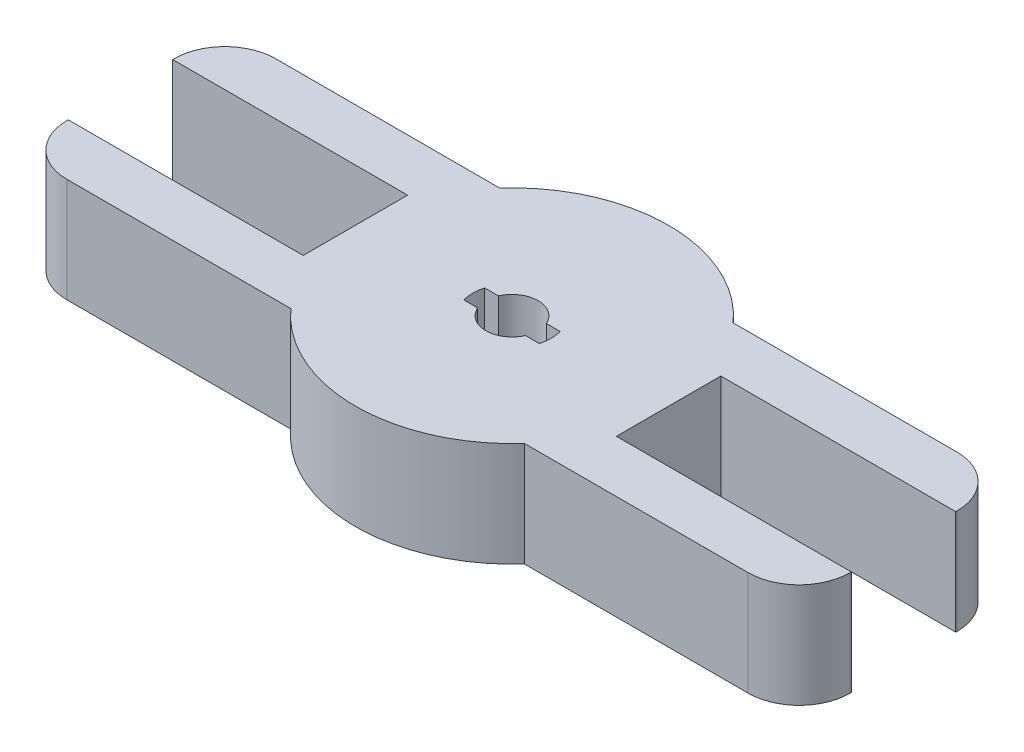
ISO-10303-21;
HEADER;
FILE_DESCRIPTION(('STEP AP214'),'2;1');
FILE_NAME('part.step','',(''),(''),'','','');
FILE_SCHEMA(('AUTOMOTIVE_DESIGN { 1 0 10303 214 1 1 1 1 }'));
ENDSEC;
DATA;
#1=APPLICATION_CONTEXT('core data for automotive mechanical design processes');
#2=APPLICATION_PROTOCOL_DEFINITION('international standard','automotive_design',2000,#1);
#3=PRODUCT_CONTEXT('',#1,'mechanical');
#4=PRODUCT('Part','Part','',(#3));
#5=PRODUCT_RELATED_PRODUCT_CATEGORY('part','',(#4));
#6=PRODUCT_DEFINITION_FORMATION('','',#4);
#7=PRODUCT_DEFINITION_CONTEXT('part definition',#1,'design');
#8=PRODUCT_DEFINITION('design','',#6,#7);
#9=PRODUCT_DEFINITION_SHAPE('','',#8);
#10=(LENGTH_UNIT() NAMED_UNIT(*) SI_UNIT(.MILLI.,.METRE.));
#11=(NAMED_UNIT(*) PLANE_ANGLE_UNIT() SI_UNIT($,.RADIAN.));
#12=(NAMED_UNIT(*) SI_UNIT($,.STERADIAN.) SOLID_ANGLE_UNIT());
#13=UNCERTAINTY_MEASURE_WITH_UNIT(LENGTH_MEASURE(1.E-05),#10,'distance_accuracy_value','');
#14=(GEOMETRIC_REPRESENTATION_CONTEXT(3) GLOBAL_UNCERTAINTY_ASSIGNED_CONTEXT((#13)) GLOBAL_UNIT_ASSIGNED_CONTEXT((#10,
#11,#12)) REPRESENTATION_CONTEXT('',''));
#15=CARTESIAN_POINT('',(0.,0.,0.));
#16=DIRECTION('',(0.,0.,1.));
#17=DIRECTION('',(1.,0.,0.));
#18=AXIS2_PLACEMENT_3D('',#15,#16,#17);
#19=CARTESIAN_POINT('',(0.,20.,0.));
#20=DIRECTION('',(0.,1.,0.));
#21=DIRECTION('',(0.,0.,1.));
#22=AXIS2_PLACEMENT_3D('',#19,#20,#21);
#23=PLANE('',#22);
#24=DIRECTION('',(0.,0.,-1.));
#25=VECTOR('',#24,1.);
#26=CARTESIAN_POINT('',(-75.,20.,-20.));
#27=LINE('',#26,#25);
#28=CARTESIAN_POINT('',(-75.,20.,10.25));
#29=VERTEX_POINT('',#28);
#30=CARTESIAN_POINT('',(-75.,20.,10.));
#31=VERTEX_POINT('',#30);
#32=EDGE_CURVE('E326',#29,#31,#27,.T.);
#33=ORIENTED_EDGE('',*,*,#32,.F.);
#34=CARTESIAN_POINT('',(-65.25,20.,10.25));
#35=DIRECTION('',(0.,1.,0.));
#36=DIRECTION('',(0.,0.,1.));
#37=AXIS2_PLACEMENT_3D('',#34,#35,#36);
#38=CIRCLE('',#37,9.75);
#39=CARTESIAN_POINT('',(-65.25,20.,20.));
#40=VERTEX_POINT('',#39);
#41=EDGE_CURVE('E511',#29,#40,#38,.T.);
#42=ORIENTED_EDGE('',*,*,#41,.T.);
#43=DIRECTION('',(-1.,0.,0.));
#44=VECTOR('',#43,1.);
#45=CARTESIAN_POINT('',(-75.,20.,20.));
#46=LINE('',#45,#44);
#47=CARTESIAN_POINT('',(-22.3606797749979,20.,20.));
#48=VERTEX_POINT('',#47);
#49=EDGE_CURVE('E329',#48,#40,#46,.T.);
#50=ORIENTED_EDGE('',*,*,#49,.F.);
#51=CARTESIAN_POINT('',(0.,20.,0.));
#52=DIRECTION('',(0.,1.,0.));
#53=DIRECTION('',(0.,0.,1.));
#54=AXIS2_PLACEMENT_3D('',#51,#52,#53);
#55=CIRCLE('',#54,30.);
#56=CARTESIAN_POINT('',(22.3606797749979,20.,20.));
#57=VERTEX_POINT('',#56);
#58=EDGE_CURVE('E431',#48,#57,#55,.T.);
#59=ORIENTED_EDGE('',*,*,#58,.T.);
#60=DIRECTION('',(1.,0.,0.));
#61=VECTOR('',#60,1.);
#62=CARTESIAN_POINT('',(75.,20.,20.));
#63=LINE('',#62,#61);
#64=CARTESIAN_POINT('',(65.25,20.,20.));
#65=VERTEX_POINT('',#64);
#66=EDGE_CURVE('E435',#57,#65,#63,.T.);
#67=ORIENTED_EDGE('',*,*,#66,.T.);
#68=CARTESIAN_POINT('',(65.25,20.,10.25));
#69=DIRECTION('',(0.,1.,0.));
#70=DIRECTION('',(0.,0.,1.));
#71=AXIS2_PLACEMENT_3D('',#68,#69,#70);
#72=CIRCLE('',#71,9.75);
#73=CARTESIAN_POINT('',(75.,20.,10.25));
#74=VERTEX_POINT('',#73);
#75=EDGE_CURVE('E486',#65,#74,#72,.T.);
#76=ORIENTED_EDGE('',*,*,#75,.T.);
#77=DIRECTION('',(0.,0.,-1.));
#78=VECTOR('',#77,1.);
#79=CARTESIAN_POINT('',(75.,20.,-20.));
#80=LINE('',#79,#78);
#81=CARTESIAN_POINT('',(75.,20.,10.));
#82=VERTEX_POINT('',#81);
#83=EDGE_CURVE('E440',#74,#82,#80,.T.);
#84=ORIENTED_EDGE('',*,*,#83,.T.);
#85=DIRECTION('',(1.,0.,0.));
#86=VECTOR('',#85,1.);
#87=CARTESIAN_POINT('',(30.,20.,10.));
#88=LINE('',#87,#86);
#89=CARTESIAN_POINT('',(30.,20.,10.));
#90=VERTEX_POINT('',#89);
#91=EDGE_CURVE('E400',#90,#82,#88,.T.);
#92=ORIENTED_EDGE('',*,*,#91,.F.);
#93=DIRECTION('',(0.,0.,1.));
#94=VECTOR('',#93,1.);
#95=CARTESIAN_POINT('',(30.,20.,-10.));
#96=LINE('',#95,#94);
#97=CARTESIAN_POINT('',(30.,20.,-10.));
#98=VERTEX_POINT('',#97);
#99=EDGE_CURVE('E415',#98,#90,#96,.T.);
#100=ORIENTED_EDGE('',*,*,#99,.F.);
#101=DIRECTION('',(-1.,0.,0.));
#102=VECTOR('',#101,1.);
#103=CARTESIAN_POINT('',(75.,20.,-10.));
#104=LINE('',#103,#102);
#105=CARTESIAN_POINT('',(75.,20.,-10.));
#106=VERTEX_POINT('',#105);
#107=EDGE_CURVE('E243',#106,#98,#104,.T.);
#108=ORIENTED_EDGE('',*,*,#107,.F.);
#109=CARTESIAN_POINT('',(75.,20.,-10.25));
#110=VERTEX_POINT('',#109);
#111=EDGE_CURVE('E439',#106,#110,#80,.T.);
#112=ORIENTED_EDGE('',*,*,#111,.T.);
#113=CARTESIAN_POINT('',(65.25,20.,-10.25));
#114=DIRECTION('',(0.,1.,0.));
#115=DIRECTION('',(0.,0.,1.));
#116=AXIS2_PLACEMENT_3D('',#113,#114,#115);
#117=CIRCLE('',#116,9.75);
#118=CARTESIAN_POINT('',(65.25,20.,-20.));
#119=VERTEX_POINT('',#118);
#120=EDGE_CURVE('E483',#110,#119,#117,.T.);
#121=ORIENTED_EDGE('',*,*,#120,.T.);
#122=DIRECTION('',(-1.,0.,0.));
#123=VECTOR('',#122,1.);
#124=CARTESIAN_POINT('',(22.3606797749979,20.,-20.));
#125=LINE('',#124,#123);
#126=CARTESIAN_POINT('',(22.3606797749979,20.,-20.));
#127=VERTEX_POINT('',#126);
#128=EDGE_CURVE('E443',#119,#127,#125,.T.);
#129=ORIENTED_EDGE('',*,*,#128,.T.);
#130=CARTESIAN_POINT('',(0.,20.,0.));
#131=DIRECTION('',(0.,1.,0.));
#132=DIRECTION('',(0.,0.,1.));
#133=AXIS2_PLACEMENT_3D('',#130,#131,#132);
#134=CIRCLE('',#133,30.);
#135=CARTESIAN_POINT('',(-22.3606797749979,20.,-20.));
#136=VERTEX_POINT('',#135);
#137=EDGE_CURVE('E427',#127,#136,#134,.T.);
#138=ORIENTED_EDGE('',*,*,#137,.T.);
#139=DIRECTION('',(1.,0.,0.));
#140=VECTOR('',#139,1.);
#141=CARTESIAN_POINT('',(-22.3606797749979,20.,-20.));
#142=LINE('',#141,#140);
#143=CARTESIAN_POINT('',(-65.25,20.,-20.));
#144=VERTEX_POINT('',#143);
#145=EDGE_CURVE('E321',#144,#136,#142,.T.);
#146=ORIENTED_EDGE('',*,*,#145,.F.);
#147=CARTESIAN_POINT('',(-65.25,20.,-10.25));
#148=DIRECTION('',(0.,1.,0.));
#149=DIRECTION('',(0.,0.,1.));
#150=AXIS2_PLACEMENT_3D('',#147,#148,#149);
#151=CIRCLE('',#150,9.75);
#152=CARTESIAN_POINT('',(-75.,20.,-10.25));
#153=VERTEX_POINT('',#152);
#154=EDGE_CURVE('E61',#144,#153,#151,.T.);
#155=ORIENTED_EDGE('',*,*,#154,.T.);
#156=CARTESIAN_POINT('',(-75.,20.,-10.));
#157=VERTEX_POINT('',#156);
#158=EDGE_CURVE('E324',#157,#153,#27,.T.);
#159=ORIENTED_EDGE('',*,*,#158,.F.);
#160=DIRECTION('',(1.,0.,0.));
#161=VECTOR('',#160,1.);
#162=CARTESIAN_POINT('',(-75.,20.,-10.));
#163=LINE('',#162,#161);
#164=CARTESIAN_POINT('',(-30.,20.,-10.));
#165=VERTEX_POINT('',#164);
#166=EDGE_CURVE('E296',#157,#165,#163,.T.);
#167=ORIENTED_EDGE('',*,*,#166,.T.);
#168=DIRECTION('',(0.,0.,1.));
#169=VECTOR('',#168,1.);
#170=CARTESIAN_POINT('',(-30.,20.,-10.));
#171=LINE('',#170,#169);
#172=CARTESIAN_POINT('',(-30.,20.,10.));
#173=VERTEX_POINT('',#172);
#174=EDGE_CURVE('E304',#165,#173,#171,.T.);
#175=ORIENTED_EDGE('',*,*,#174,.T.);
#176=DIRECTION('',(-1.,0.,0.));
#177=VECTOR('',#176,1.);
#178=CARTESIAN_POINT('',(-30.,20.,10.));
#179=LINE('',#178,#177);
#180=EDGE_CURVE('E300',#173,#31,#179,.T.);
#181=ORIENTED_EDGE('',*,*,#180,.T.);
#182=EDGE_LOOP('',(#33,#42,#50,#59,#67,#76,#84,#92,#100,#108,#112,#121,#129,#138,#146,#155,#159,
#167,#175,#181));
#183=FACE_BOUND('',#182,.T.);
#184=CARTESIAN_POINT('',(0.,20.,0.));
#185=DIRECTION('',(0.,1.,0.));
#186=DIRECTION('',(0.,0.,1.));
#187=AXIS2_PLACEMENT_3D('',#184,#185,#186);
#188=CIRCLE('',#187,5.);
#189=CARTESIAN_POINT('',(-4.58257569495584,20.,2.));
#190=VERTEX_POINT('',#189);
#191=CARTESIAN_POINT('',(4.58257569495584,20.,2.));
#192=VERTEX_POINT('',#191);
#193=EDGE_CURVE('E242',#190,#192,#188,.T.);
#194=ORIENTED_EDGE('',*,*,#193,.F.);
#195=DIRECTION('',(-1.,0.,0.));
#196=VECTOR('',#195,1.);
#197=CARTESIAN_POINT('',(-7.22841614740048,20.,2.));
#198=LINE('',#197,#196);
#199=CARTESIAN_POINT('',(-7.22841614740048,20.,2.));
#200=VERTEX_POINT('',#199);
#201=EDGE_CURVE('E256',#190,#200,#198,.T.);
#202=ORIENTED_EDGE('',*,*,#201,.T.);
#203=CARTESIAN_POINT('',(0.,20.,0.));
#204=DIRECTION('',(0.,-1.,0.));
#205=DIRECTION('',(0.,0.,1.));
#206=AXIS2_PLACEMENT_3D('',#203,#204,#205);
#207=CIRCLE('',#206,7.5);
#208=CARTESIAN_POINT('',(-7.22841614740048,20.,-2.));
#209=VERTEX_POINT('',#208);
#210=EDGE_CURVE('E260',#200,#209,#207,.T.);
#211=ORIENTED_EDGE('',*,*,#210,.T.);
#212=DIRECTION('',(1.,0.,0.));
#213=VECTOR('',#212,1.);
#214=CARTESIAN_POINT('',(-7.22841614740048,20.,-2.));
#215=LINE('',#214,#213);
#216=CARTESIAN_POINT('',(-4.58257569495584,20.,-2.));
#217=VERTEX_POINT('',#216);
#218=EDGE_CURVE('E250',#209,#217,#215,.T.);
#219=ORIENTED_EDGE('',*,*,#218,.T.);
#220=CARTESIAN_POINT('',(0.,20.,0.));
#221=DIRECTION('',(0.,1.,0.));
#222=DIRECTION('',(0.,0.,1.));
#223=AXIS2_PLACEMENT_3D('',#220,#221,#222);
#224=CIRCLE('',#223,5.);
#225=CARTESIAN_POINT('',(4.58257569495584,20.,-2.));
#226=VERTEX_POINT('',#225);
#227=EDGE_CURVE('E231',#226,#217,#224,.T.);
#228=ORIENTED_EDGE('',*,*,#227,.F.);
#229=DIRECTION('',(-1.,0.,0.));
#230=VECTOR('',#229,1.);
#231=CARTESIAN_POINT('',(7.22841614740048,20.,-2.));
#232=LINE('',#231,#230);
#233=CARTESIAN_POINT('',(7.22841614740048,20.,-2.));
#234=VERTEX_POINT('',#233);
#235=EDGE_CURVE('E380',#234,#226,#232,.T.);
#236=ORIENTED_EDGE('',*,*,#235,.F.);
#237=CARTESIAN_POINT('',(0.,20.,0.));
#238=DIRECTION('',(0.,1.,0.));
#239=DIRECTION('',(0.,0.,1.));
#240=AXIS2_PLACEMENT_3D('',#237,#238,#239);
#241=CIRCLE('',#240,7.5);
#242=CARTESIAN_POINT('',(7.22841614740048,20.,2.));
#243=VERTEX_POINT('',#242);
#244=EDGE_CURVE('E376',#243,#234,#241,.T.);
#245=ORIENTED_EDGE('',*,*,#244,.F.);
#246=DIRECTION('',(1.,0.,0.));
#247=VECTOR('',#246,1.);
#248=CARTESIAN_POINT('',(7.22841614740048,20.,2.));
#249=LINE('',#248,#247);
#250=EDGE_CURVE('E372',#192,#243,#249,.T.);
#251=ORIENTED_EDGE('',*,*,#250,.F.);
#252=EDGE_LOOP('',(#194,#202,#211,#219,#228,#236,#245,#251));
#253=FACE_BOUND('',#252,.T.);
#254=ADVANCED_FACE('F45',(#183,#253),#23,.T.);
#255=CARTESIAN_POINT('',(0.,0.,0.));
#256=DIRECTION('',(0.,1.,0.));
#257=DIRECTION('',(0.,0.,1.));
#258=AXIS2_PLACEMENT_3D('',#255,#256,#257);
#259=PLANE('',#258);
#260=DIRECTION('',(-1.,0.,0.));
#261=VECTOR('',#260,1.);
#262=CARTESIAN_POINT('',(-75.,0.,20.));
#263=LINE('',#262,#261);
#264=CARTESIAN_POINT('',(-22.3606797749979,0.,20.));
#265=VERTEX_POINT('',#264);
#266=CARTESIAN_POINT('',(-65.25,0.,20.));
#267=VERTEX_POINT('',#266);
#268=EDGE_CURVE('E325',#265,#267,#263,.T.);
#269=ORIENTED_EDGE('',*,*,#268,.T.);
#270=CARTESIAN_POINT('',(-65.25,0.,10.25));
#271=DIRECTION('',(0.,1.,0.));
#272=DIRECTION('',(0.,0.,1.));
#273=AXIS2_PLACEMENT_3D('',#270,#271,#272);
#274=CIRCLE('',#273,9.75);
#275=CARTESIAN_POINT('',(-75.,0.,10.25));
#276=VERTEX_POINT('',#275);
#277=EDGE_CURVE('E503',#267,#276,#274,.F.);
#278=ORIENTED_EDGE('',*,*,#277,.T.);
#279=DIRECTION('',(0.,0.,-1.));
#280=VECTOR('',#279,1.);
#281=CARTESIAN_POINT('',(-75.,0.,-20.));
#282=LINE('',#281,#280);
#283=CARTESIAN_POINT('',(-75.,0.,10.));
#284=VERTEX_POINT('',#283);
#285=EDGE_CURVE('E338',#276,#284,#282,.T.);
#286=ORIENTED_EDGE('',*,*,#285,.T.);
#287=DIRECTION('',(1.,0.,0.));
#288=VECTOR('',#287,1.);
#289=CARTESIAN_POINT('',(-30.,0.,10.));
#290=LINE('',#289,#288);
#291=CARTESIAN_POINT('',(-30.,0.,10.));
#292=VERTEX_POINT('',#291);
#293=EDGE_CURVE('E288',#284,#292,#290,.T.);
#294=ORIENTED_EDGE('',*,*,#293,.T.);
#295=DIRECTION('',(0.,0.,-1.));
#296=VECTOR('',#295,1.);
#297=CARTESIAN_POINT('',(-30.,0.,-10.));
#298=LINE('',#297,#296);
#299=CARTESIAN_POINT('',(-30.,0.,-10.));
#300=VERTEX_POINT('',#299);
#301=EDGE_CURVE('E268',#292,#300,#298,.T.);
#302=ORIENTED_EDGE('',*,*,#301,.T.);
#303=DIRECTION('',(-1.,0.,0.));
#304=VECTOR('',#303,1.);
#305=CARTESIAN_POINT('',(-75.,0.,-10.));
#306=LINE('',#305,#304);
#307=CARTESIAN_POINT('',(-75.,0.,-10.));
#308=VERTEX_POINT('',#307);
#309=EDGE_CURVE('E262',#300,#308,#306,.T.);
#310=ORIENTED_EDGE('',*,*,#309,.T.);
#311=CARTESIAN_POINT('',(-75.,0.,-10.25));
#312=VERTEX_POINT('',#311);
#313=EDGE_CURVE('E337',#308,#312,#282,.T.);
#314=ORIENTED_EDGE('',*,*,#313,.T.);
#315=CARTESIAN_POINT('',(-65.25,0.,-10.25));
#316=DIRECTION('',(0.,1.,0.));
#317=DIRECTION('',(0.,0.,1.));
#318=AXIS2_PLACEMENT_3D('',#315,#316,#317);
#319=CIRCLE('',#318,9.75);
#320=CARTESIAN_POINT('',(-65.25,0.,-20.));
#321=VERTEX_POINT('',#320);
#322=EDGE_CURVE('E500',#312,#321,#319,.F.);
#323=ORIENTED_EDGE('',*,*,#322,.T.);
#324=DIRECTION('',(1.,0.,0.));
#325=VECTOR('',#324,1.);
#326=CARTESIAN_POINT('',(-22.3606797749979,0.,-20.));
#327=LINE('',#326,#325);
#328=CARTESIAN_POINT('',(-22.3606797749979,0.,-20.));
#329=VERTEX_POINT('',#328);
#330=EDGE_CURVE('E334',#321,#329,#327,.T.);
#331=ORIENTED_EDGE('',*,*,#330,.T.);
#332=CARTESIAN_POINT('',(0.,0.,0.));
#333=DIRECTION('',(0.,1.,0.));
#334=DIRECTION('',(0.,0.,1.));
#335=AXIS2_PLACEMENT_3D('',#332,#333,#334);
#336=CIRCLE('',#335,30.);
#337=CARTESIAN_POINT('',(22.3606797749979,0.,-20.));
#338=VERTEX_POINT('',#337);
#339=EDGE_CURVE('E367',#338,#329,#336,.T.);
#340=ORIENTED_EDGE('',*,*,#339,.F.);
#341=DIRECTION('',(-1.,0.,0.));
#342=VECTOR('',#341,1.);
#343=CARTESIAN_POINT('',(22.3606797749979,0.,-20.));
#344=LINE('',#343,#342);
#345=CARTESIAN_POINT('',(65.25,0.,-20.));
#346=VERTEX_POINT('',#345);
#347=EDGE_CURVE('E432',#346,#338,#344,.T.);
#348=ORIENTED_EDGE('',*,*,#347,.F.);
#349=CARTESIAN_POINT('',(65.25,0.,-10.25));
#350=DIRECTION('',(0.,1.,0.));
#351=DIRECTION('',(0.,0.,1.));
#352=AXIS2_PLACEMENT_3D('',#349,#350,#351);
#353=CIRCLE('',#352,9.75);
#354=CARTESIAN_POINT('',(75.,0.,-10.25));
#355=VERTEX_POINT('',#354);
#356=EDGE_CURVE('E474',#346,#355,#353,.F.);
#357=ORIENTED_EDGE('',*,*,#356,.T.);
#358=DIRECTION('',(0.,0.,-1.));
#359=VECTOR('',#358,1.);
#360=CARTESIAN_POINT('',(75.,0.,-20.));
#361=LINE('',#360,#359);
#362=CARTESIAN_POINT('',(75.,0.,-10.));
#363=VERTEX_POINT('',#362);
#364=EDGE_CURVE('E457',#363,#355,#361,.T.);
#365=ORIENTED_EDGE('',*,*,#364,.F.);
#366=DIRECTION('',(1.,0.,0.));
#367=VECTOR('',#366,1.);
#368=CARTESIAN_POINT('',(75.,0.,-10.));
#369=LINE('',#368,#367);
#370=CARTESIAN_POINT('',(30.,0.,-10.));
#371=VERTEX_POINT('',#370);
#372=EDGE_CURVE('E396',#371,#363,#369,.T.);
#373=ORIENTED_EDGE('',*,*,#372,.F.);
#374=DIRECTION('',(0.,0.,-1.));
#375=VECTOR('',#374,1.);
#376=CARTESIAN_POINT('',(30.,0.,-10.));
#377=LINE('',#376,#375);
#378=CARTESIAN_POINT('',(30.,0.,10.));
#379=VERTEX_POINT('',#378);
#380=EDGE_CURVE('E351',#379,#371,#377,.T.);
#381=ORIENTED_EDGE('',*,*,#380,.F.);
#382=DIRECTION('',(-1.,0.,0.));
#383=VECTOR('',#382,1.);
#384=CARTESIAN_POINT('',(30.,0.,10.));
#385=LINE('',#384,#383);
#386=CARTESIAN_POINT('',(75.,0.,10.));
#387=VERTEX_POINT('',#386);
#388=EDGE_CURVE('E411',#387,#379,#385,.T.);
#389=ORIENTED_EDGE('',*,*,#388,.F.);
#390=CARTESIAN_POINT('',(75.,0.,10.25));
#391=VERTEX_POINT('',#390);
#392=EDGE_CURVE('E458',#391,#387,#361,.T.);
#393=ORIENTED_EDGE('',*,*,#392,.F.);
#394=CARTESIAN_POINT('',(65.25,0.,10.25));
#395=DIRECTION('',(0.,1.,0.));
#396=DIRECTION('',(0.,0.,1.));
#397=AXIS2_PLACEMENT_3D('',#394,#395,#396);
#398=CIRCLE('',#397,9.75);
#399=CARTESIAN_POINT('',(65.25,0.,20.));
#400=VERTEX_POINT('',#399);
#401=EDGE_CURVE('E477',#391,#400,#398,.F.);
#402=ORIENTED_EDGE('',*,*,#401,.T.);
#403=DIRECTION('',(1.,0.,0.));
#404=VECTOR('',#403,1.);
#405=CARTESIAN_POINT('',(75.,0.,20.));
#406=LINE('',#405,#404);
#407=CARTESIAN_POINT('',(22.3606797749979,0.,20.));
#408=VERTEX_POINT('',#407);
#409=EDGE_CURVE('E453',#408,#400,#406,.T.);
#410=ORIENTED_EDGE('',*,*,#409,.F.);
#411=CARTESIAN_POINT('',(0.,0.,0.));
#412=DIRECTION('',(0.,1.,0.));
#413=DIRECTION('',(0.,0.,1.));
#414=AXIS2_PLACEMENT_3D('',#411,#412,#413);
#415=CIRCLE('',#414,30.);
#416=EDGE_CURVE('E450',#265,#408,#415,.T.);
#417=ORIENTED_EDGE('',*,*,#416,.F.);
#418=EDGE_LOOP('',(#269,#278,#286,#294,#302,#310,#314,#323,#331,#340,#348,#357,#365,#373,#381,
#389,#393,#402,#410,#417));
#419=FACE_BOUND('',#418,.T.);
#420=DIRECTION('',(1.,0.,0.));
#421=VECTOR('',#420,1.);
#422=CARTESIAN_POINT('',(-7.22841614740048,0.,2.));
#423=LINE('',#422,#421);
#424=CARTESIAN_POINT('',(-7.22841614740048,0.,2.));
#425=VERTEX_POINT('',#424);
#426=CARTESIAN_POINT('',(-4.58257569495584,0.,2.));
#427=VERTEX_POINT('',#426);
#428=EDGE_CURVE('E271',#425,#427,#423,.T.);
#429=ORIENTED_EDGE('',*,*,#428,.T.);
#430=CARTESIAN_POINT('',(0.,0.,0.));
#431=DIRECTION('',(0.,1.,0.));
#432=DIRECTION('',(0.,0.,1.));
#433=AXIS2_PLACEMENT_3D('',#430,#431,#432);
#434=CIRCLE('',#433,5.);
#435=CARTESIAN_POINT('',(4.58257569495584,0.,2.));
#436=VERTEX_POINT('',#435);
#437=EDGE_CURVE('E352',#436,#427,#434,.F.);
#438=ORIENTED_EDGE('',*,*,#437,.F.);
#439=DIRECTION('',(-1.,0.,0.));
#440=VECTOR('',#439,1.);
#441=CARTESIAN_POINT('',(7.22841614740048,0.,2.));
#442=LINE('',#441,#440);
#443=CARTESIAN_POINT('',(7.22841614740048,0.,2.));
#444=VERTEX_POINT('',#443);
#445=EDGE_CURVE('E355',#444,#436,#442,.T.);
#446=ORIENTED_EDGE('',*,*,#445,.F.);
#447=CARTESIAN_POINT('',(0.,0.,0.));
#448=DIRECTION('',(0.,1.,0.));
#449=DIRECTION('',(0.,0.,1.));
#450=AXIS2_PLACEMENT_3D('',#447,#448,#449);
#451=CIRCLE('',#450,7.5);
#452=CARTESIAN_POINT('',(7.22841614740048,0.,-2.));
#453=VERTEX_POINT('',#452);
#454=EDGE_CURVE('E359',#453,#444,#451,.F.);
#455=ORIENTED_EDGE('',*,*,#454,.F.);
#456=DIRECTION('',(1.,0.,0.));
#457=VECTOR('',#456,1.);
#458=CARTESIAN_POINT('',(7.22841614740048,0.,-2.));
#459=LINE('',#458,#457);
#460=CARTESIAN_POINT('',(4.58257569495584,0.,-2.));
#461=VERTEX_POINT('',#460);
#462=EDGE_CURVE('E362',#461,#453,#459,.T.);
#463=ORIENTED_EDGE('',*,*,#462,.F.);
#464=CARTESIAN_POINT('',(0.,0.,0.));
#465=DIRECTION('',(0.,1.,0.));
#466=DIRECTION('',(0.,0.,1.));
#467=AXIS2_PLACEMENT_3D('',#464,#465,#466);
#468=CIRCLE('',#467,5.);
#469=CARTESIAN_POINT('',(-4.58257569495584,0.,-2.));
#470=VERTEX_POINT('',#469);
#471=EDGE_CURVE('E365',#470,#461,#468,.F.);
#472=ORIENTED_EDGE('',*,*,#471,.F.);
#473=DIRECTION('',(-1.,0.,0.));
#474=VECTOR('',#473,1.);
#475=CARTESIAN_POINT('',(-7.22841614740048,0.,-2.));
#476=LINE('',#475,#474);
#477=CARTESIAN_POINT('',(-7.22841614740048,0.,-2.));
#478=VERTEX_POINT('',#477);
#479=EDGE_CURVE('E253',#470,#478,#476,.T.);
#480=ORIENTED_EDGE('',*,*,#479,.T.);
#481=CARTESIAN_POINT('',(0.,0.,0.));
#482=DIRECTION('',(0.,1.,0.));
#483=DIRECTION('',(0.,0.,1.));
#484=AXIS2_PLACEMENT_3D('',#481,#482,#483);
#485=CIRCLE('',#484,7.5);
#486=EDGE_CURVE('E287',#478,#425,#485,.T.);
#487=ORIENTED_EDGE('',*,*,#486,.T.);
#488=EDGE_LOOP('',(#429,#438,#446,#455,#463,#472,#480,#487));
#489=FACE_BOUND('',#488,.T.);
#490=ADVANCED_FACE('F522',(#419,#489),#259,.F.);
#491=CARTESIAN_POINT('',(-75.,20.,-20.));
#492=DIRECTION('',(-1.,0.,0.));
#493=DIRECTION('',(0.,0.,1.));
#494=AXIS2_PLACEMENT_3D('',#491,#492,#493);
#495=PLANE('',#494);
#496=ORIENTED_EDGE('',*,*,#285,.F.);
#497=DIRECTION('',(0.,-1.,0.));
#498=VECTOR('',#497,1.);
#499=CARTESIAN_POINT('',(-75.,20.,10.25));
#500=LINE('',#499,#498);
#501=EDGE_CURVE('E506',#276,#29,#500,.F.);
#502=ORIENTED_EDGE('',*,*,#501,.T.);
#503=ORIENTED_EDGE('',*,*,#32,.T.);
#504=DIRECTION('',(0.,1.,0.));
#505=VECTOR('',#504,1.);
#506=CARTESIAN_POINT('',(-75.,-49.2442890089805,10.));
#507=LINE('',#506,#505);
#508=EDGE_CURVE('E314',#284,#31,#507,.T.);
#509=ORIENTED_EDGE('',*,*,#508,.F.);
#510=EDGE_LOOP('',(#496,#502,#503,#509));
#511=FACE_BOUND('',#510,.T.);
#512=ADVANCED_FACE('F569',(#511),#495,.T.);
#513=ORIENTED_EDGE('',*,*,#158,.T.);
#514=DIRECTION('',(0.,-1.,0.));
#515=VECTOR('',#514,1.);
#516=CARTESIAN_POINT('',(-75.,20.,-10.25));
#517=LINE('',#516,#515);
#518=EDGE_CURVE('E54',#153,#312,#517,.T.);
#519=ORIENTED_EDGE('',*,*,#518,.T.);
#520=ORIENTED_EDGE('',*,*,#313,.F.);
#521=DIRECTION('',(0.,1.,0.));
#522=VECTOR('',#521,1.);
#523=CARTESIAN_POINT('',(-75.,-49.2442890089805,-10.));
#524=LINE('',#523,#522);
#525=EDGE_CURVE('E308',#308,#157,#524,.T.);
#526=ORIENTED_EDGE('',*,*,#525,.T.);
#527=EDGE_LOOP('',(#513,#519,#520,#526));
#528=FACE_BOUND('',#527,.T.);
#529=ADVANCED_FACE('F519',(#528),#495,.T.);
#530=CARTESIAN_POINT('',(75.,20.,-20.));
#531=DIRECTION('',(-1.,0.,0.));
#532=DIRECTION('',(0.,0.,1.));
#533=AXIS2_PLACEMENT_3D('',#530,#531,#532);
#534=PLANE('',#533);
#535=ORIENTED_EDGE('',*,*,#364,.T.);
#536=DIRECTION('',(0.,-1.,0.));
#537=VECTOR('',#536,1.);
#538=CARTESIAN_POINT('',(75.,20.,-10.25));
#539=LINE('',#538,#537);
#540=EDGE_CURVE('E493',#355,#110,#539,.F.);
#541=ORIENTED_EDGE('',*,*,#540,.T.);
#542=ORIENTED_EDGE('',*,*,#111,.F.);
#543=DIRECTION('',(0.,1.,0.));
#544=VECTOR('',#543,1.);
#545=CARTESIAN_POINT('',(75.,-49.2442890089805,-10.));
#546=LINE('',#545,#544);
#547=EDGE_CURVE('E408',#363,#106,#546,.T.);
#548=ORIENTED_EDGE('',*,*,#547,.F.);
#549=EDGE_LOOP('',(#535,#541,#542,#548));
#550=FACE_BOUND('',#549,.T.);
#551=ADVANCED_FACE('F586',(#550),#534,.F.);
#552=CARTESIAN_POINT('',(0.,20.,0.));
#553=DIRECTION('',(0.,-1.,0.));
#554=DIRECTION('',(0.,0.,-1.));
#555=AXIS2_PLACEMENT_3D('',#552,#553,#554);
#556=CYLINDRICAL_SURFACE('',#555,30.);
#557=ORIENTED_EDGE('',*,*,#339,.T.);
#558=DIRECTION('',(0.,-1.,0.));
#559=VECTOR('',#558,1.);
#560=CARTESIAN_POINT('',(-22.3606797749979,20.,-20.));
#561=LINE('',#560,#559);
#562=EDGE_CURVE('E347',#136,#329,#561,.T.);
#563=ORIENTED_EDGE('',*,*,#562,.F.);
#564=ORIENTED_EDGE('',*,*,#137,.F.);
#565=DIRECTION('',(0.,-1.,0.));
#566=VECTOR('',#565,1.);
#567=CARTESIAN_POINT('',(22.3606797749979,20.,-20.));
#568=LINE('',#567,#566);
#569=EDGE_CURVE('E446',#127,#338,#568,.T.);
#570=ORIENTED_EDGE('',*,*,#569,.T.);
#571=EDGE_LOOP('',(#557,#563,#564,#570));
#572=FACE_BOUND('',#571,.T.);
#573=ADVANCED_FACE('F593',(#572),#556,.T.);
#574=CARTESIAN_POINT('',(0.,20.,0.));
#575=DIRECTION('',(0.,-1.,0.));
#576=DIRECTION('',(0.,0.,-1.));
#577=AXIS2_PLACEMENT_3D('',#574,#575,#576);
#578=CYLINDRICAL_SURFACE('',#577,30.);
#579=ORIENTED_EDGE('',*,*,#416,.T.);
#580=DIRECTION('',(0.,-1.,0.));
#581=VECTOR('',#580,1.);
#582=CARTESIAN_POINT('',(22.3606797749979,20.,20.));
#583=LINE('',#582,#581);
#584=EDGE_CURVE('E466',#57,#408,#583,.T.);
#585=ORIENTED_EDGE('',*,*,#584,.F.);
#586=ORIENTED_EDGE('',*,*,#58,.F.);
#587=DIRECTION('',(0.,-1.,0.));
#588=VECTOR('',#587,1.);
#589=CARTESIAN_POINT('',(-22.3606797749979,20.,20.));
#590=LINE('',#589,#588);
#591=EDGE_CURVE('E333',#48,#265,#590,.T.);
#592=ORIENTED_EDGE('',*,*,#591,.T.);
#593=EDGE_LOOP('',(#579,#585,#586,#592));
#594=FACE_BOUND('',#593,.T.);
#595=ADVANCED_FACE('F589',(#594),#578,.T.);
#596=CARTESIAN_POINT('',(75.,20.,20.));
#597=DIRECTION('',(0.,0.,-1.));
#598=DIRECTION('',(-1.,0.,0.));
#599=AXIS2_PLACEMENT_3D('',#596,#597,#598);
#600=PLANE('',#599);
#601=ORIENTED_EDGE('',*,*,#409,.T.);
#602=DIRECTION('',(0.,-1.,0.));
#603=VECTOR('',#602,1.);
#604=CARTESIAN_POINT('',(65.25,20.,20.));
#605=LINE('',#604,#603);
#606=EDGE_CURVE('E480',#400,#65,#605,.F.);
#607=ORIENTED_EDGE('',*,*,#606,.T.);
#608=ORIENTED_EDGE('',*,*,#66,.F.);
#609=ORIENTED_EDGE('',*,*,#584,.T.);
#610=EDGE_LOOP('',(#601,#607,#608,#609));
#611=FACE_BOUND('',#610,.T.);
#612=ADVANCED_FACE('F584',(#611),#600,.F.);
#613=ORIENTED_EDGE('',*,*,#83,.F.);
#614=DIRECTION('',(0.,-1.,0.));
#615=VECTOR('',#614,1.);
#616=CARTESIAN_POINT('',(75.,20.,10.25));
#617=LINE('',#616,#615);
#618=EDGE_CURVE('E470',#74,#391,#617,.T.);
#619=ORIENTED_EDGE('',*,*,#618,.T.);
#620=ORIENTED_EDGE('',*,*,#392,.T.);
#621=DIRECTION('',(0.,1.,0.));
#622=VECTOR('',#621,1.);
#623=CARTESIAN_POINT('',(75.,-49.2442890089805,10.));
#624=LINE('',#623,#622);
#625=EDGE_CURVE('E404',#387,#82,#624,.T.);
#626=ORIENTED_EDGE('',*,*,#625,.T.);
#627=EDGE_LOOP('',(#613,#619,#620,#626));
#628=FACE_BOUND('',#627,.T.);
#629=ADVANCED_FACE('F580',(#628),#534,.F.);
#630=CARTESIAN_POINT('',(22.3606797749979,20.,-20.));
#631=DIRECTION('',(0.,0.,1.));
#632=DIRECTION('',(1.,0.,0.));
#633=AXIS2_PLACEMENT_3D('',#630,#631,#632);
#634=PLANE('',#633);
#635=ORIENTED_EDGE('',*,*,#128,.F.);
#636=DIRECTION('',(0.,-1.,0.));
#637=VECTOR('',#636,1.);
#638=CARTESIAN_POINT('',(65.25,20.,-20.));
#639=LINE('',#638,#637);
#640=EDGE_CURVE('E489',#119,#346,#639,.T.);
#641=ORIENTED_EDGE('',*,*,#640,.T.);
#642=ORIENTED_EDGE('',*,*,#347,.T.);
#643=ORIENTED_EDGE('',*,*,#569,.F.);
#644=EDGE_LOOP('',(#635,#641,#642,#643));
#645=FACE_BOUND('',#644,.T.);
#646=ADVANCED_FACE('F576',(#645),#634,.F.);
#647=CARTESIAN_POINT('',(75.,-49.2442890089805,-10.));
#648=DIRECTION('',(0.,0.,-1.));
#649=DIRECTION('',(-1.,0.,0.));
#650=AXIS2_PLACEMENT_3D('',#647,#648,#649);
#651=PLANE('',#650);
#652=ORIENTED_EDGE('',*,*,#372,.T.);
#653=ORIENTED_EDGE('',*,*,#547,.T.);
#654=ORIENTED_EDGE('',*,*,#107,.T.);
#655=DIRECTION('',(0.,1.,0.));
#656=VECTOR('',#655,1.);
#657=CARTESIAN_POINT('',(30.,-49.2442890089805,-10.));
#658=LINE('',#657,#656);
#659=EDGE_CURVE('E397',#371,#98,#658,.T.);
#660=ORIENTED_EDGE('',*,*,#659,.F.);
#661=EDGE_LOOP('',(#652,#653,#654,#660));
#662=FACE_BOUND('',#661,.T.);
#663=ADVANCED_FACE('F579',(#662),#651,.F.);
#664=CARTESIAN_POINT('',(30.,-49.2442890089805,10.));
#665=DIRECTION('',(0.,0.,1.));
#666=DIRECTION('',(1.,0.,0.));
#667=AXIS2_PLACEMENT_3D('',#664,#665,#666);
#668=PLANE('',#667);
#669=ORIENTED_EDGE('',*,*,#388,.T.);
#670=DIRECTION('',(0.,1.,0.));
#671=VECTOR('',#670,1.);
#672=CARTESIAN_POINT('',(30.,-49.2442890089805,10.));
#673=LINE('',#672,#671);
#674=EDGE_CURVE('E401',#379,#90,#673,.T.);
#675=ORIENTED_EDGE('',*,*,#674,.T.);
#676=ORIENTED_EDGE('',*,*,#91,.T.);
#677=ORIENTED_EDGE('',*,*,#625,.F.);
#678=EDGE_LOOP('',(#669,#675,#676,#677));
#679=FACE_BOUND('',#678,.T.);
#680=ADVANCED_FACE('F573',(#679),#668,.F.);
#681=CARTESIAN_POINT('',(30.,-49.2442890089805,-10.));
#682=DIRECTION('',(-1.,0.,0.));
#683=DIRECTION('',(0.,0.,1.));
#684=AXIS2_PLACEMENT_3D('',#681,#682,#683);
#685=PLANE('',#684);
#686=ORIENTED_EDGE('',*,*,#380,.T.);
#687=ORIENTED_EDGE('',*,*,#659,.T.);
#688=ORIENTED_EDGE('',*,*,#99,.T.);
#689=ORIENTED_EDGE('',*,*,#674,.F.);
#690=EDGE_LOOP('',(#686,#687,#688,#689));
#691=FACE_BOUND('',#690,.T.);
#692=ADVANCED_FACE('F560',(#691),#685,.F.);
#693=CARTESIAN_POINT('',(0.,-49.2442890089805,0.));
#694=DIRECTION('',(0.,1.,0.));
#695=DIRECTION('',(0.,0.,1.));
#696=AXIS2_PLACEMENT_3D('',#693,#694,#695);
#697=CYLINDRICAL_SURFACE('',#696,5.);
#698=ORIENTED_EDGE('',*,*,#471,.T.);
#699=DIRECTION('',(0.,1.,0.));
#700=VECTOR('',#699,1.);
#701=CARTESIAN_POINT('',(4.58257569495584,-49.2442890089805,-2.));
#702=LINE('',#701,#700);
#703=EDGE_CURVE('E236',#461,#226,#702,.T.);
#704=ORIENTED_EDGE('',*,*,#703,.T.);
#705=ORIENTED_EDGE('',*,*,#227,.T.);
#706=DIRECTION('',(0.,1.,0.));
#707=VECTOR('',#706,1.);
#708=CARTESIAN_POINT('',(-4.58257569495584,-49.2442890089805,-2.));
#709=LINE('',#708,#707);
#710=EDGE_CURVE('E234',#470,#217,#709,.T.);
#711=ORIENTED_EDGE('',*,*,#710,.F.);
#712=EDGE_LOOP('',(#698,#704,#705,#711));
#713=FACE_BOUND('',#712,.T.);
#714=ADVANCED_FACE('F233',(#713),#697,.F.);
#715=CARTESIAN_POINT('',(7.22841614740048,-49.2442890089805,-2.));
#716=DIRECTION('',(0.,0.,-1.));
#717=DIRECTION('',(-1.,0.,0.));
#718=AXIS2_PLACEMENT_3D('',#715,#716,#717);
#719=PLANE('',#718);
#720=ORIENTED_EDGE('',*,*,#462,.T.);
#721=DIRECTION('',(0.,1.,0.));
#722=VECTOR('',#721,1.);
#723=CARTESIAN_POINT('',(7.22841614740048,-49.2442890089805,-2.));
#724=LINE('',#723,#722);
#725=EDGE_CURVE('E386',#453,#234,#724,.T.);
#726=ORIENTED_EDGE('',*,*,#725,.T.);
#727=ORIENTED_EDGE('',*,*,#235,.T.);
#728=ORIENTED_EDGE('',*,*,#703,.F.);
#729=EDGE_LOOP('',(#720,#726,#727,#728));
#730=FACE_BOUND('',#729,.T.);
#731=ADVANCED_FACE('F551',(#730),#719,.F.);
#732=CARTESIAN_POINT('',(0.,-49.2442890089805,0.));
#733=DIRECTION('',(0.,1.,0.));
#734=DIRECTION('',(0.,0.,1.));
#735=AXIS2_PLACEMENT_3D('',#732,#733,#734);
#736=CYLINDRICAL_SURFACE('',#735,7.5);
#737=ORIENTED_EDGE('',*,*,#454,.T.);
#738=DIRECTION('',(0.,1.,0.));
#739=VECTOR('',#738,1.);
#740=CARTESIAN_POINT('',(7.22841614740048,-49.2442890089805,2.));
#741=LINE('',#740,#739);
#742=EDGE_CURVE('E389',#444,#243,#741,.T.);
#743=ORIENTED_EDGE('',*,*,#742,.T.);
#744=ORIENTED_EDGE('',*,*,#244,.T.);
#745=ORIENTED_EDGE('',*,*,#725,.F.);
#746=EDGE_LOOP('',(#737,#743,#744,#745));
#747=FACE_BOUND('',#746,.T.);
#748=ADVANCED_FACE('F548',(#747),#736,.F.);
#749=CARTESIAN_POINT('',(7.22841614740048,-49.2442890089805,2.));
#750=DIRECTION('',(0.,0.,1.));
#751=DIRECTION('',(1.,0.,0.));
#752=AXIS2_PLACEMENT_3D('',#749,#750,#751);
#753=PLANE('',#752);
#754=ORIENTED_EDGE('',*,*,#445,.T.);
#755=DIRECTION('',(0.,1.,0.));
#756=VECTOR('',#755,1.);
#757=CARTESIAN_POINT('',(4.58257569495584,-49.2442890089805,2.));
#758=LINE('',#757,#756);
#759=EDGE_CURVE('E383',#436,#192,#758,.T.);
#760=ORIENTED_EDGE('',*,*,#759,.T.);
#761=ORIENTED_EDGE('',*,*,#250,.T.);
#762=ORIENTED_EDGE('',*,*,#742,.F.);
#763=EDGE_LOOP('',(#754,#760,#761,#762));
#764=FACE_BOUND('',#763,.T.);
#765=ADVANCED_FACE('F545',(#764),#753,.F.);
#766=CARTESIAN_POINT('',(0.,-49.2442890089805,0.));
#767=DIRECTION('',(0.,1.,0.));
#768=DIRECTION('',(0.,0.,1.));
#769=AXIS2_PLACEMENT_3D('',#766,#767,#768);
#770=CYLINDRICAL_SURFACE('',#769,5.);
#771=ORIENTED_EDGE('',*,*,#437,.T.);
#772=DIRECTION('',(0.,1.,0.));
#773=VECTOR('',#772,1.);
#774=CARTESIAN_POINT('',(-4.58257569495584,-49.2442890089805,2.));
#775=LINE('',#774,#773);
#776=EDGE_CURVE('E276',#427,#190,#775,.T.);
#777=ORIENTED_EDGE('',*,*,#776,.T.);
#778=ORIENTED_EDGE('',*,*,#193,.T.);
#779=ORIENTED_EDGE('',*,*,#759,.F.);
#780=EDGE_LOOP('',(#771,#777,#778,#779));
#781=FACE_BOUND('',#780,.T.);
#782=ADVANCED_FACE('F538',(#781),#770,.F.);
#783=CARTESIAN_POINT('',(65.25,20.,10.25));
#784=DIRECTION('',(0.,-1.,0.));
#785=DIRECTION('',(0.,0.,-1.));
#786=AXIS2_PLACEMENT_3D('',#783,#784,#785);
#787=CYLINDRICAL_SURFACE('',#786,9.75);
#788=ORIENTED_EDGE('',*,*,#75,.F.);
#789=ORIENTED_EDGE('',*,*,#606,.F.);
#790=ORIENTED_EDGE('',*,*,#401,.F.);
#791=ORIENTED_EDGE('',*,*,#618,.F.);
#792=EDGE_LOOP('',(#788,#789,#790,#791));
#793=FACE_BOUND('',#792,.T.);
#794=ADVANCED_FACE('F598',(#793),#787,.T.);
#795=CARTESIAN_POINT('',(65.25,20.,-10.25));
#796=DIRECTION('',(0.,-1.,0.));
#797=DIRECTION('',(0.,0.,-1.));
#798=AXIS2_PLACEMENT_3D('',#795,#796,#797);
#799=CYLINDRICAL_SURFACE('',#798,9.75);
#800=ORIENTED_EDGE('',*,*,#120,.F.);
#801=ORIENTED_EDGE('',*,*,#540,.F.);
#802=ORIENTED_EDGE('',*,*,#356,.F.);
#803=ORIENTED_EDGE('',*,*,#640,.F.);
#804=EDGE_LOOP('',(#800,#801,#802,#803));
#805=FACE_BOUND('',#804,.T.);
#806=ADVANCED_FACE('F601',(#805),#799,.T.);
#807=CARTESIAN_POINT('',(-22.3606797749979,20.,-20.));
#808=DIRECTION('',(0.,0.,-1.));
#809=DIRECTION('',(-1.,0.,0.));
#810=AXIS2_PLACEMENT_3D('',#807,#808,#809);
#811=PLANE('',#810);
#812=ORIENTED_EDGE('',*,*,#330,.F.);
#813=DIRECTION('',(0.,-1.,0.));
#814=VECTOR('',#813,1.);
#815=CARTESIAN_POINT('',(-65.25,20.,-20.));
#816=LINE('',#815,#814);
#817=EDGE_CURVE('E11',#321,#144,#816,.F.);
#818=ORIENTED_EDGE('',*,*,#817,.T.);
#819=ORIENTED_EDGE('',*,*,#145,.T.);
#820=ORIENTED_EDGE('',*,*,#562,.T.);
#821=EDGE_LOOP('',(#812,#818,#819,#820));
#822=FACE_BOUND('',#821,.T.);
#823=ADVANCED_FACE('F603',(#822),#811,.T.);
#824=CARTESIAN_POINT('',(-75.,20.,20.));
#825=DIRECTION('',(0.,0.,1.));
#826=DIRECTION('',(1.,0.,0.));
#827=AXIS2_PLACEMENT_3D('',#824,#825,#826);
#828=PLANE('',#827);
#829=ORIENTED_EDGE('',*,*,#49,.T.);
#830=DIRECTION('',(0.,-1.,0.));
#831=VECTOR('',#830,1.);
#832=CARTESIAN_POINT('',(-65.25,20.,20.));
#833=LINE('',#832,#831);
#834=EDGE_CURVE('E496',#40,#267,#833,.T.);
#835=ORIENTED_EDGE('',*,*,#834,.T.);
#836=ORIENTED_EDGE('',*,*,#268,.F.);
#837=ORIENTED_EDGE('',*,*,#591,.F.);
#838=EDGE_LOOP('',(#829,#835,#836,#837));
#839=FACE_BOUND('',#838,.T.);
#840=ADVANCED_FACE('F619',(#839),#828,.T.);
#841=CARTESIAN_POINT('',(-30.,-49.2442890089805,10.));
#842=DIRECTION('',(0.,0.,-1.));
#843=DIRECTION('',(-1.,0.,0.));
#844=AXIS2_PLACEMENT_3D('',#841,#842,#843);
#845=PLANE('',#844);
#846=ORIENTED_EDGE('',*,*,#508,.T.);
#847=ORIENTED_EDGE('',*,*,#180,.F.);
#848=DIRECTION('',(0.,1.,0.));
#849=VECTOR('',#848,1.);
#850=CARTESIAN_POINT('',(-30.,-49.2442890089805,10.));
#851=LINE('',#850,#849);
#852=EDGE_CURVE('E311',#292,#173,#851,.T.);
#853=ORIENTED_EDGE('',*,*,#852,.F.);
#854=ORIENTED_EDGE('',*,*,#293,.F.);
#855=EDGE_LOOP('',(#846,#847,#853,#854));
#856=FACE_BOUND('',#855,.T.);
#857=ADVANCED_FACE('F663',(#856),#845,.T.);
#858=CARTESIAN_POINT('',(-30.,-49.2442890089805,-10.));
#859=DIRECTION('',(-1.,0.,0.));
#860=DIRECTION('',(0.,0.,1.));
#861=AXIS2_PLACEMENT_3D('',#858,#859,#860);
#862=PLANE('',#861);
#863=ORIENTED_EDGE('',*,*,#852,.T.);
#864=ORIENTED_EDGE('',*,*,#174,.F.);
#865=DIRECTION('',(0.,1.,0.));
#866=VECTOR('',#865,1.);
#867=CARTESIAN_POINT('',(-30.,-49.2442890089805,-10.));
#868=LINE('',#867,#866);
#869=EDGE_CURVE('E292',#300,#165,#868,.T.);
#870=ORIENTED_EDGE('',*,*,#869,.F.);
#871=ORIENTED_EDGE('',*,*,#301,.F.);
#872=EDGE_LOOP('',(#863,#864,#870,#871));
#873=FACE_BOUND('',#872,.T.);
#874=ADVANCED_FACE('F672',(#873),#862,.T.);
#875=CARTESIAN_POINT('',(-75.,-49.2442890089805,-10.));
#876=DIRECTION('',(0.,0.,1.));
#877=DIRECTION('',(1.,0.,0.));
#878=AXIS2_PLACEMENT_3D('',#875,#876,#877);
#879=PLANE('',#878);
#880=ORIENTED_EDGE('',*,*,#869,.T.);
#881=ORIENTED_EDGE('',*,*,#166,.F.);
#882=ORIENTED_EDGE('',*,*,#525,.F.);
#883=ORIENTED_EDGE('',*,*,#309,.F.);
#884=EDGE_LOOP('',(#880,#881,#882,#883));
#885=FACE_BOUND('',#884,.T.);
#886=ADVANCED_FACE('F669',(#885),#879,.T.);
#887=CARTESIAN_POINT('',(-7.22841614740048,-49.2442890089805,-2.));
#888=DIRECTION('',(0.,0.,1.));
#889=DIRECTION('',(1.,0.,0.));
#890=AXIS2_PLACEMENT_3D('',#887,#888,#889);
#891=PLANE('',#890);
#892=ORIENTED_EDGE('',*,*,#710,.T.);
#893=ORIENTED_EDGE('',*,*,#218,.F.);
#894=DIRECTION('',(0.,1.,0.));
#895=VECTOR('',#894,1.);
#896=CARTESIAN_POINT('',(-7.22841614740048,-49.2442890089805,-2.));
#897=LINE('',#896,#895);
#898=EDGE_CURVE('E255',#478,#209,#897,.T.);
#899=ORIENTED_EDGE('',*,*,#898,.F.);
#900=ORIENTED_EDGE('',*,*,#479,.F.);
#901=EDGE_LOOP('',(#892,#893,#899,#900));
#902=FACE_BOUND('',#901,.T.);
#903=ADVANCED_FACE('F248',(#902),#891,.T.);
#904=CARTESIAN_POINT('',(0.,-49.2442890089805,0.));
#905=DIRECTION('',(0.,1.,0.));
#906=DIRECTION('',(0.,0.,1.));
#907=AXIS2_PLACEMENT_3D('',#904,#905,#906);
#908=CYLINDRICAL_SURFACE('',#907,7.5);
#909=ORIENTED_EDGE('',*,*,#898,.T.);
#910=ORIENTED_EDGE('',*,*,#210,.F.);
#911=DIRECTION('',(0.,1.,0.));
#912=VECTOR('',#911,1.);
#913=CARTESIAN_POINT('',(-7.22841614740048,-49.2442890089805,2.));
#914=LINE('',#913,#912);
#915=EDGE_CURVE('E280',#425,#200,#914,.T.);
#916=ORIENTED_EDGE('',*,*,#915,.F.);
#917=ORIENTED_EDGE('',*,*,#486,.F.);
#918=EDGE_LOOP('',(#909,#910,#916,#917));
#919=FACE_BOUND('',#918,.T.);
#920=ADVANCED_FACE('F532',(#919),#908,.F.);
#921=CARTESIAN_POINT('',(-7.22841614740048,-49.2442890089805,2.));
#922=DIRECTION('',(0.,0.,-1.));
#923=DIRECTION('',(-1.,0.,0.));
#924=AXIS2_PLACEMENT_3D('',#921,#922,#923);
#925=PLANE('',#924);
#926=ORIENTED_EDGE('',*,*,#915,.T.);
#927=ORIENTED_EDGE('',*,*,#201,.F.);
#928=ORIENTED_EDGE('',*,*,#776,.F.);
#929=ORIENTED_EDGE('',*,*,#428,.F.);
#930=EDGE_LOOP('',(#926,#927,#928,#929));
#931=FACE_BOUND('',#930,.T.);
#932=ADVANCED_FACE('F535',(#931),#925,.T.);
#933=CARTESIAN_POINT('',(-65.25,20.,10.25));
#934=DIRECTION('',(0.,-1.,0.));
#935=DIRECTION('',(0.,0.,-1.));
#936=AXIS2_PLACEMENT_3D('',#933,#934,#935);
#937=CYLINDRICAL_SURFACE('',#936,9.75);
#938=ORIENTED_EDGE('',*,*,#41,.F.);
#939=ORIENTED_EDGE('',*,*,#501,.F.);
#940=ORIENTED_EDGE('',*,*,#277,.F.);
#941=ORIENTED_EDGE('',*,*,#834,.F.);
#942=EDGE_LOOP('',(#938,#939,#940,#941));
#943=FACE_BOUND('',#942,.T.);
#944=ADVANCED_FACE('F605',(#943),#937,.T.);
#945=CARTESIAN_POINT('',(-65.25,20.,-10.25));
#946=DIRECTION('',(0.,-1.,0.));
#947=DIRECTION('',(0.,0.,-1.));
#948=AXIS2_PLACEMENT_3D('',#945,#946,#947);
#949=CYLINDRICAL_SURFACE('',#948,9.75);
#950=ORIENTED_EDGE('',*,*,#154,.F.);
#951=ORIENTED_EDGE('',*,*,#817,.F.);
#952=ORIENTED_EDGE('',*,*,#322,.F.);
#953=ORIENTED_EDGE('',*,*,#518,.F.);
#954=EDGE_LOOP('',(#950,#951,#952,#953));
#955=FACE_BOUND('',#954,.T.);
#956=ADVANCED_FACE('F47',(#955),#949,.T.);
#957=CLOSED_SHELL('',(#254,#490,#512,#529,#551,#573,#595,#612,#629,#646,#663,#680,#692,#714,
#731,#748,#765,#782,#794,#806,#823,#840,#857,#874,#886,#903,#920,#932,#944,#956));
#958=MANIFOLD_SOLID_BREP('B2',#957);
#959=ADVANCED_BREP_SHAPE_REPRESENTATION('',(#18,#958),#14);
#960=SHAPE_DEFINITION_REPRESENTATION(#9,#959);
ENDSEC;
END-ISO-10303-21;
